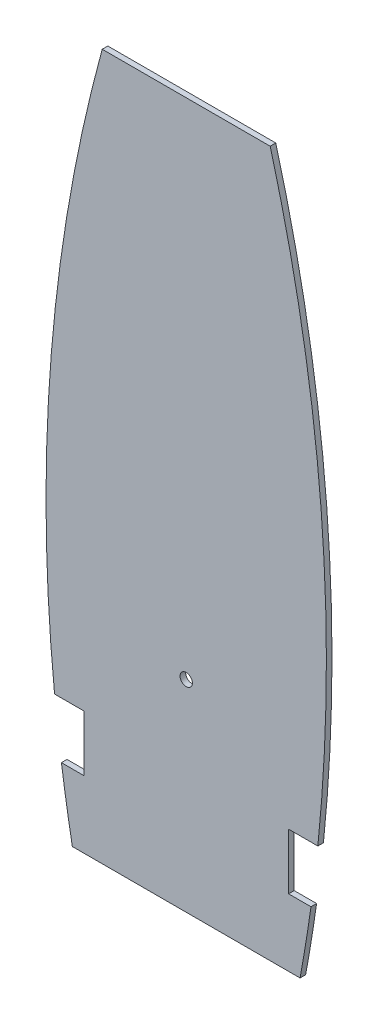
ISO-10303-21;
HEADER;
FILE_DESCRIPTION(('STEP AP214'),'2;1');
FILE_NAME('part.step','',(''),(''),'','','');
FILE_SCHEMA(('AUTOMOTIVE_DESIGN { 1 0 10303 214 1 1 1 1 }'));
ENDSEC;
DATA;
#1=APPLICATION_CONTEXT('core data for automotive mechanical design processes');
#2=APPLICATION_PROTOCOL_DEFINITION('international standard','automotive_design',2000,#1);
#3=PRODUCT_CONTEXT('',#1,'mechanical');
#4=PRODUCT('Part','Part','',(#3));
#5=PRODUCT_RELATED_PRODUCT_CATEGORY('part','',(#4));
#6=PRODUCT_DEFINITION_FORMATION('','',#4);
#7=PRODUCT_DEFINITION_CONTEXT('part definition',#1,'design');
#8=PRODUCT_DEFINITION('design','',#6,#7);
#9=PRODUCT_DEFINITION_SHAPE('','',#8);
#10=(LENGTH_UNIT() NAMED_UNIT(*) SI_UNIT(.MILLI.,.METRE.));
#11=(NAMED_UNIT(*) PLANE_ANGLE_UNIT() SI_UNIT($,.RADIAN.));
#12=(NAMED_UNIT(*) SI_UNIT($,.STERADIAN.) SOLID_ANGLE_UNIT());
#13=UNCERTAINTY_MEASURE_WITH_UNIT(LENGTH_MEASURE(1.E-05),#10,'distance_accuracy_value','');
#14=(GEOMETRIC_REPRESENTATION_CONTEXT(3) GLOBAL_UNCERTAINTY_ASSIGNED_CONTEXT((#13)) GLOBAL_UNIT_ASSIGNED_CONTEXT((#10,
#11,#12)) REPRESENTATION_CONTEXT('',''));
#15=CARTESIAN_POINT('',(0.,0.,0.));
#16=DIRECTION('',(0.,0.,1.));
#17=DIRECTION('',(1.,0.,0.));
#18=AXIS2_PLACEMENT_3D('',#15,#16,#17);
#19=CARTESIAN_POINT('',(-1287.92539340169,-373.27505620024,5.));
#20=DIRECTION('',(0.,0.,-1.));
#21=DIRECTION('',(-1.,0.,0.));
#22=AXIS2_PLACEMENT_3D('',#19,#20,#21);
#23=CYLINDRICAL_SURFACE('',#22,1413.11708487317);
#24=CARTESIAN_POINT('',(-1287.92539340169,-373.27505620024,5.));
#25=DIRECTION('',(0.,0.,1.));
#26=DIRECTION('',(-1.,0.,0.));
#27=AXIS2_PLACEMENT_3D('',#24,#25,#26);
#28=CIRCLE('',#27,1413.11708487317);
#29=CARTESIAN_POINT('',(117.553772728993,-520.,5.));
#30=VERTEX_POINT('',#29);
#31=CARTESIAN_POINT('',(75.,0.,5.));
#32=VERTEX_POINT('',#31);
#33=EDGE_CURVE('E158',#30,#32,#28,.T.);
#34=ORIENTED_EDGE('',*,*,#33,.F.);
#35=DIRECTION('',(0.,0.,-1.));
#36=VECTOR('',#35,1.);
#37=CARTESIAN_POINT('',(117.553772728993,-520.,5.));
#38=LINE('',#37,#36);
#39=CARTESIAN_POINT('',(117.553772728993,-520.,0.));
#40=VERTEX_POINT('',#39);
#41=EDGE_CURVE('E204',#30,#40,#38,.T.);
#42=ORIENTED_EDGE('',*,*,#41,.T.);
#43=CARTESIAN_POINT('',(-1287.92539340169,-373.27505620024,0.));
#44=DIRECTION('',(0.,0.,1.));
#45=DIRECTION('',(-1.,0.,0.));
#46=AXIS2_PLACEMENT_3D('',#43,#44,#45);
#47=CIRCLE('',#46,1413.11708487317);
#48=CARTESIAN_POINT('',(75.,0.,0.));
#49=VERTEX_POINT('',#48);
#50=EDGE_CURVE('E151',#40,#49,#47,.T.);
#51=ORIENTED_EDGE('',*,*,#50,.T.);
#52=DIRECTION('',(0.,0.,-1.));
#53=VECTOR('',#52,1.);
#54=CARTESIAN_POINT('',(75.,0.,5.));
#55=LINE('',#54,#53);
#56=EDGE_CURVE('E11',#32,#49,#55,.T.);
#57=ORIENTED_EDGE('',*,*,#56,.F.);
#58=EDGE_LOOP('',(#34,#42,#51,#57));
#59=FACE_BOUND('',#58,.T.);
#60=ADVANCED_FACE('F33',(#59),#23,.T.);
#61=CARTESIAN_POINT('',(1287.92539340169,-373.27505620024,5.));
#62=DIRECTION('',(0.,0.,-1.));
#63=DIRECTION('',(-1.,0.,0.));
#64=AXIS2_PLACEMENT_3D('',#61,#62,#63);
#65=CYLINDRICAL_SURFACE('',#64,1413.11708487317);
#66=CARTESIAN_POINT('',(1287.92539340169,-373.27505620024,0.));
#67=DIRECTION('',(0.,0.,1.));
#68=DIRECTION('',(1.,0.,0.));
#69=AXIS2_PLACEMENT_3D('',#66,#67,#68);
#70=CIRCLE('',#69,1413.11708487317);
#71=CARTESIAN_POINT('',(-111.431313105777,-570.,0.));
#72=VERTEX_POINT('',#71);
#73=CARTESIAN_POINT('',(-101.676059818425,-630.,0.));
#74=VERTEX_POINT('',#73);
#75=EDGE_CURVE('E157',#72,#74,#70,.T.);
#76=ORIENTED_EDGE('',*,*,#75,.T.);
#77=DIRECTION('',(0.,0.,-1.));
#78=VECTOR('',#77,1.);
#79=CARTESIAN_POINT('',(-101.676059818425,-630.,5.));
#80=LINE('',#79,#78);
#81=CARTESIAN_POINT('',(-101.676059818425,-630.,5.));
#82=VERTEX_POINT('',#81);
#83=EDGE_CURVE('E48',#82,#74,#80,.T.);
#84=ORIENTED_EDGE('',*,*,#83,.F.);
#85=CARTESIAN_POINT('',(1287.92539340169,-373.27505620024,5.));
#86=DIRECTION('',(0.,0.,1.));
#87=DIRECTION('',(1.,0.,0.));
#88=AXIS2_PLACEMENT_3D('',#85,#86,#87);
#89=CIRCLE('',#88,1413.11708487317);
#90=CARTESIAN_POINT('',(-111.431313105777,-570.,5.));
#91=VERTEX_POINT('',#90);
#92=EDGE_CURVE('E146',#91,#82,#89,.T.);
#93=ORIENTED_EDGE('',*,*,#92,.F.);
#94=DIRECTION('',(0.,0.,-1.));
#95=VECTOR('',#94,1.);
#96=CARTESIAN_POINT('',(-111.431313105777,-570.,5.));
#97=LINE('',#96,#95);
#98=EDGE_CURVE('E166',#91,#72,#97,.T.);
#99=ORIENTED_EDGE('',*,*,#98,.T.);
#100=EDGE_LOOP('',(#76,#84,#93,#99));
#101=FACE_BOUND('',#100,.T.);
#102=ADVANCED_FACE('F164',(#101),#65,.T.);
#103=CARTESIAN_POINT('',(101.676059818425,-630.,5.));
#104=VERTEX_POINT('',#103);
#105=CARTESIAN_POINT('',(111.431313105777,-570.,5.));
#106=VERTEX_POINT('',#105);
#107=EDGE_CURVE('E159',#104,#106,#28,.T.);
#108=ORIENTED_EDGE('',*,*,#107,.F.);
#109=DIRECTION('',(0.,0.,-1.));
#110=VECTOR('',#109,1.);
#111=CARTESIAN_POINT('',(101.676059818425,-630.,5.));
#112=LINE('',#111,#110);
#113=CARTESIAN_POINT('',(101.676059818425,-630.,0.));
#114=VERTEX_POINT('',#113);
#115=EDGE_CURVE('E182',#104,#114,#112,.T.);
#116=ORIENTED_EDGE('',*,*,#115,.T.);
#117=CARTESIAN_POINT('',(111.431313105777,-570.,0.));
#118=VERTEX_POINT('',#117);
#119=EDGE_CURVE('E153',#114,#118,#47,.T.);
#120=ORIENTED_EDGE('',*,*,#119,.T.);
#121=DIRECTION('',(0.,0.,-1.));
#122=VECTOR('',#121,1.);
#123=CARTESIAN_POINT('',(111.431313105777,-570.,5.));
#124=LINE('',#123,#122);
#125=EDGE_CURVE('E196',#106,#118,#124,.T.);
#126=ORIENTED_EDGE('',*,*,#125,.F.);
#127=EDGE_LOOP('',(#108,#116,#120,#126));
#128=FACE_BOUND('',#127,.T.);
#129=ADVANCED_FACE('F35',(#128),#23,.T.);
#130=CARTESIAN_POINT('',(-75.,0.,5.));
#131=DIRECTION('',(0.,-1.,0.));
#132=DIRECTION('',(1.,0.,0.));
#133=AXIS2_PLACEMENT_3D('',#130,#131,#132);
#134=PLANE('',#133);
#135=DIRECTION('',(-1.,0.,0.));
#136=VECTOR('',#135,1.);
#137=CARTESIAN_POINT('',(-75.,0.,0.));
#138=LINE('',#137,#136);
#139=CARTESIAN_POINT('',(-75.,0.,0.));
#140=VERTEX_POINT('',#139);
#141=EDGE_CURVE('E155',#49,#140,#138,.T.);
#142=ORIENTED_EDGE('',*,*,#141,.T.);
#143=DIRECTION('',(0.,0.,-1.));
#144=VECTOR('',#143,1.);
#145=CARTESIAN_POINT('',(-75.,0.,5.));
#146=LINE('',#145,#144);
#147=CARTESIAN_POINT('',(-75.,0.,5.));
#148=VERTEX_POINT('',#147);
#149=EDGE_CURVE('E41',#148,#140,#146,.T.);
#150=ORIENTED_EDGE('',*,*,#149,.F.);
#151=DIRECTION('',(-1.,0.,0.));
#152=VECTOR('',#151,1.);
#153=CARTESIAN_POINT('',(-75.,0.,5.));
#154=LINE('',#153,#152);
#155=EDGE_CURVE('E144',#32,#148,#154,.T.);
#156=ORIENTED_EDGE('',*,*,#155,.F.);
#157=ORIENTED_EDGE('',*,*,#56,.T.);
#158=EDGE_LOOP('',(#142,#150,#156,#157));
#159=FACE_BOUND('',#158,.T.);
#160=ADVANCED_FACE('F240',(#159),#134,.F.);
#161=CARTESIAN_POINT('',(-117.553772728993,-520.,0.));
#162=VERTEX_POINT('',#161);
#163=EDGE_CURVE('E138',#140,#162,#70,.T.);
#164=ORIENTED_EDGE('',*,*,#163,.T.);
#165=DIRECTION('',(0.,0.,-1.));
#166=VECTOR('',#165,1.);
#167=CARTESIAN_POINT('',(-117.553772728993,-520.,5.));
#168=LINE('',#167,#166);
#169=CARTESIAN_POINT('',(-117.553772728993,-520.,5.));
#170=VERTEX_POINT('',#169);
#171=EDGE_CURVE('E56',#170,#162,#168,.T.);
#172=ORIENTED_EDGE('',*,*,#171,.F.);
#173=EDGE_CURVE('E136',#148,#170,#89,.T.);
#174=ORIENTED_EDGE('',*,*,#173,.F.);
#175=ORIENTED_EDGE('',*,*,#149,.T.);
#176=EDGE_LOOP('',(#164,#172,#174,#175));
#177=FACE_BOUND('',#176,.T.);
#178=ADVANCED_FACE('F134',(#177),#65,.T.);
#179=CARTESIAN_POINT('',(-1287.92539340169,-373.27505620024,5.));
#180=DIRECTION('',(0.,0.,-1.));
#181=DIRECTION('',(-1.,0.,0.));
#182=AXIS2_PLACEMENT_3D('',#179,#180,#181);
#183=PLANE('',#182);
#184=CARTESIAN_POINT('',(0.,-450.,5.));
#185=DIRECTION('',(0.,0.,-1.));
#186=DIRECTION('',(-1.,0.,0.));
#187=AXIS2_PLACEMENT_3D('',#184,#185,#186);
#188=CIRCLE('',#187,5.5);
#189=CARTESIAN_POINT('',(-5.5,-450.,5.));
#190=VERTEX_POINT('',#189);
#191=EDGE_CURVE('E154',#190,#190,#188,.T.);
#192=ORIENTED_EDGE('',*,*,#191,.T.);
#193=EDGE_LOOP('',(#192));
#194=FACE_BOUND('',#193,.T.);
#195=ORIENTED_EDGE('',*,*,#92,.T.);
#196=DIRECTION('',(1.,0.,0.));
#197=VECTOR('',#196,1.);
#198=CARTESIAN_POINT('',(-101.676059818425,-630.,5.));
#199=LINE('',#198,#197);
#200=EDGE_CURVE('E177',#82,#104,#199,.T.);
#201=ORIENTED_EDGE('',*,*,#200,.T.);
#202=ORIENTED_EDGE('',*,*,#107,.T.);
#203=DIRECTION('',(-1.,0.,0.));
#204=VECTOR('',#203,1.);
#205=CARTESIAN_POINT('',(91.4313131057769,-570.,5.));
#206=LINE('',#205,#204);
#207=CARTESIAN_POINT('',(91.4313131057769,-570.,5.));
#208=VERTEX_POINT('',#207);
#209=EDGE_CURVE('E186',#106,#208,#206,.T.);
#210=ORIENTED_EDGE('',*,*,#209,.T.);
#211=DIRECTION('',(0.,1.,0.));
#212=VECTOR('',#211,1.);
#213=CARTESIAN_POINT('',(91.4313131057769,-520.,5.));
#214=LINE('',#213,#212);
#215=CARTESIAN_POINT('',(91.4313131057769,-520.,5.));
#216=VERTEX_POINT('',#215);
#217=EDGE_CURVE('E189',#208,#216,#214,.T.);
#218=ORIENTED_EDGE('',*,*,#217,.T.);
#219=DIRECTION('',(1.,0.,0.));
#220=VECTOR('',#219,1.);
#221=CARTESIAN_POINT('',(117.553772728993,-520.,5.));
#222=LINE('',#221,#220);
#223=EDGE_CURVE('E193',#216,#30,#222,.T.);
#224=ORIENTED_EDGE('',*,*,#223,.T.);
#225=ORIENTED_EDGE('',*,*,#33,.T.);
#226=ORIENTED_EDGE('',*,*,#155,.T.);
#227=ORIENTED_EDGE('',*,*,#173,.T.);
#228=DIRECTION('',(1.,0.,0.));
#229=VECTOR('',#228,1.);
#230=CARTESIAN_POINT('',(-117.553772728993,-520.,5.));
#231=LINE('',#230,#229);
#232=CARTESIAN_POINT('',(-91.4313131057769,-520.,5.));
#233=VERTEX_POINT('',#232);
#234=EDGE_CURVE('E121',#170,#233,#231,.T.);
#235=ORIENTED_EDGE('',*,*,#234,.T.);
#236=DIRECTION('',(0.,-1.,0.));
#237=VECTOR('',#236,1.);
#238=CARTESIAN_POINT('',(-91.4313131057769,-520.,5.));
#239=LINE('',#238,#237);
#240=CARTESIAN_POINT('',(-91.4313131057769,-570.,5.));
#241=VERTEX_POINT('',#240);
#242=EDGE_CURVE('E128',#233,#241,#239,.T.);
#243=ORIENTED_EDGE('',*,*,#242,.T.);
#244=DIRECTION('',(-1.,0.,0.));
#245=VECTOR('',#244,1.);
#246=CARTESIAN_POINT('',(-91.4313131057769,-570.,5.));
#247=LINE('',#246,#245);
#248=EDGE_CURVE('E139',#241,#91,#247,.T.);
#249=ORIENTED_EDGE('',*,*,#248,.T.);
#250=EDGE_LOOP('',(#195,#201,#202,#210,#218,#224,#225,#226,#227,#235,#243,#249));
#251=FACE_BOUND('',#250,.T.);
#252=ADVANCED_FACE('F142',(#194,#251),#183,.F.);
#253=CARTESIAN_POINT('',(-1287.92539340169,-373.27505620024,0.));
#254=DIRECTION('',(0.,0.,-1.));
#255=DIRECTION('',(-1.,0.,0.));
#256=AXIS2_PLACEMENT_3D('',#253,#254,#255);
#257=PLANE('',#256);
#258=DIRECTION('',(1.,0.,0.));
#259=VECTOR('',#258,1.);
#260=CARTESIAN_POINT('',(-101.676059818425,-630.,0.));
#261=LINE('',#260,#259);
#262=EDGE_CURVE('E173',#74,#114,#261,.T.);
#263=ORIENTED_EDGE('',*,*,#262,.F.);
#264=ORIENTED_EDGE('',*,*,#75,.F.);
#265=DIRECTION('',(-1.,0.,0.));
#266=VECTOR('',#265,1.);
#267=CARTESIAN_POINT('',(-91.4313131057769,-570.,0.));
#268=LINE('',#267,#266);
#269=CARTESIAN_POINT('',(-91.4313131057769,-570.,0.));
#270=VERTEX_POINT('',#269);
#271=EDGE_CURVE('E129',#270,#72,#268,.T.);
#272=ORIENTED_EDGE('',*,*,#271,.F.);
#273=DIRECTION('',(0.,-1.,0.));
#274=VECTOR('',#273,1.);
#275=CARTESIAN_POINT('',(-91.4313131057769,-520.,0.));
#276=LINE('',#275,#274);
#277=CARTESIAN_POINT('',(-91.4313131057769,-520.,0.));
#278=VERTEX_POINT('',#277);
#279=EDGE_CURVE('E285',#278,#270,#276,.T.);
#280=ORIENTED_EDGE('',*,*,#279,.F.);
#281=DIRECTION('',(1.,0.,0.));
#282=VECTOR('',#281,1.);
#283=CARTESIAN_POINT('',(-117.553772728993,-520.,0.));
#284=LINE('',#283,#282);
#285=EDGE_CURVE('E184',#162,#278,#284,.T.);
#286=ORIENTED_EDGE('',*,*,#285,.F.);
#287=ORIENTED_EDGE('',*,*,#163,.F.);
#288=ORIENTED_EDGE('',*,*,#141,.F.);
#289=ORIENTED_EDGE('',*,*,#50,.F.);
#290=DIRECTION('',(1.,0.,0.));
#291=VECTOR('',#290,1.);
#292=CARTESIAN_POINT('',(117.553772728993,-520.,0.));
#293=LINE('',#292,#291);
#294=CARTESIAN_POINT('',(91.4313131057769,-520.,0.));
#295=VERTEX_POINT('',#294);
#296=EDGE_CURVE('E190',#295,#40,#293,.T.);
#297=ORIENTED_EDGE('',*,*,#296,.F.);
#298=DIRECTION('',(0.,1.,0.));
#299=VECTOR('',#298,1.);
#300=CARTESIAN_POINT('',(91.4313131057769,-520.,0.));
#301=LINE('',#300,#299);
#302=CARTESIAN_POINT('',(91.4313131057769,-570.,0.));
#303=VERTEX_POINT('',#302);
#304=EDGE_CURVE('E200',#303,#295,#301,.T.);
#305=ORIENTED_EDGE('',*,*,#304,.F.);
#306=DIRECTION('',(-1.,0.,0.));
#307=VECTOR('',#306,1.);
#308=CARTESIAN_POINT('',(91.4313131057769,-570.,0.));
#309=LINE('',#308,#307);
#310=EDGE_CURVE('E197',#118,#303,#309,.T.);
#311=ORIENTED_EDGE('',*,*,#310,.F.);
#312=ORIENTED_EDGE('',*,*,#119,.F.);
#313=EDGE_LOOP('',(#263,#264,#272,#280,#286,#287,#288,#289,#297,#305,#311,#312));
#314=FACE_BOUND('',#313,.T.);
#315=CARTESIAN_POINT('',(0.,-450.,0.));
#316=DIRECTION('',(0.,0.,-1.));
#317=DIRECTION('',(-1.,0.,0.));
#318=AXIS2_PLACEMENT_3D('',#315,#316,#317);
#319=CIRCLE('',#318,5.5);
#320=CARTESIAN_POINT('',(-5.5,-450.,0.));
#321=VERTEX_POINT('',#320);
#322=EDGE_CURVE('E207',#321,#321,#319,.T.);
#323=ORIENTED_EDGE('',*,*,#322,.F.);
#324=EDGE_LOOP('',(#323));
#325=FACE_BOUND('',#324,.T.);
#326=ADVANCED_FACE('F169',(#314,#325),#257,.T.);
#327=CARTESIAN_POINT('',(0.,-450.,5.));
#328=DIRECTION('',(0.,0.,-1.));
#329=DIRECTION('',(-1.,0.,0.));
#330=AXIS2_PLACEMENT_3D('',#327,#328,#329);
#331=CYLINDRICAL_SURFACE('',#330,5.5);
#332=ORIENTED_EDGE('',*,*,#191,.F.);
#333=EDGE_LOOP('',(#332));
#334=FACE_BOUND('',#333,.T.);
#335=ORIENTED_EDGE('',*,*,#322,.T.);
#336=EDGE_LOOP('',(#335));
#337=FACE_BOUND('',#336,.T.);
#338=ADVANCED_FACE('F218',(#334,#337),#331,.F.);
#339=CARTESIAN_POINT('',(117.553772728993,-520.,5.));
#340=DIRECTION('',(0.,1.,0.));
#341=DIRECTION('',(-1.,0.,0.));
#342=AXIS2_PLACEMENT_3D('',#339,#340,#341);
#343=PLANE('',#342);
#344=ORIENTED_EDGE('',*,*,#296,.T.);
#345=ORIENTED_EDGE('',*,*,#41,.F.);
#346=ORIENTED_EDGE('',*,*,#223,.F.);
#347=DIRECTION('',(0.,0.,-1.));
#348=VECTOR('',#347,1.);
#349=CARTESIAN_POINT('',(91.4313131057769,-520.,5.));
#350=LINE('',#349,#348);
#351=EDGE_CURVE('E208',#216,#295,#350,.T.);
#352=ORIENTED_EDGE('',*,*,#351,.T.);
#353=EDGE_LOOP('',(#344,#345,#346,#352));
#354=FACE_BOUND('',#353,.T.);
#355=ADVANCED_FACE('F226',(#354),#343,.F.);
#356=CARTESIAN_POINT('',(91.4313131057769,-520.,5.));
#357=DIRECTION('',(-1.,0.,0.));
#358=DIRECTION('',(0.,0.,1.));
#359=AXIS2_PLACEMENT_3D('',#356,#357,#358);
#360=PLANE('',#359);
#361=ORIENTED_EDGE('',*,*,#304,.T.);
#362=ORIENTED_EDGE('',*,*,#351,.F.);
#363=ORIENTED_EDGE('',*,*,#217,.F.);
#364=DIRECTION('',(0.,0.,-1.));
#365=VECTOR('',#364,1.);
#366=CARTESIAN_POINT('',(91.4313131057769,-570.,5.));
#367=LINE('',#366,#365);
#368=EDGE_CURVE('E210',#208,#303,#367,.T.);
#369=ORIENTED_EDGE('',*,*,#368,.T.);
#370=EDGE_LOOP('',(#361,#362,#363,#369));
#371=FACE_BOUND('',#370,.T.);
#372=ADVANCED_FACE('F263',(#371),#360,.F.);
#373=CARTESIAN_POINT('',(91.4313131057769,-570.,5.));
#374=DIRECTION('',(0.,-1.,0.));
#375=DIRECTION('',(0.,0.,-1.));
#376=AXIS2_PLACEMENT_3D('',#373,#374,#375);
#377=PLANE('',#376);
#378=ORIENTED_EDGE('',*,*,#310,.T.);
#379=ORIENTED_EDGE('',*,*,#368,.F.);
#380=ORIENTED_EDGE('',*,*,#209,.F.);
#381=ORIENTED_EDGE('',*,*,#125,.T.);
#382=EDGE_LOOP('',(#378,#379,#380,#381));
#383=FACE_BOUND('',#382,.T.);
#384=ADVANCED_FACE('F267',(#383),#377,.F.);
#385=CARTESIAN_POINT('',(-91.4313131057769,-570.,5.));
#386=DIRECTION('',(0.,-1.,0.));
#387=DIRECTION('',(0.,0.,-1.));
#388=AXIS2_PLACEMENT_3D('',#385,#386,#387);
#389=PLANE('',#388);
#390=ORIENTED_EDGE('',*,*,#271,.T.);
#391=ORIENTED_EDGE('',*,*,#98,.F.);
#392=ORIENTED_EDGE('',*,*,#248,.F.);
#393=DIRECTION('',(0.,0.,-1.));
#394=VECTOR('',#393,1.);
#395=CARTESIAN_POINT('',(-91.4313131057769,-570.,5.));
#396=LINE('',#395,#394);
#397=EDGE_CURVE('E293',#241,#270,#396,.T.);
#398=ORIENTED_EDGE('',*,*,#397,.T.);
#399=EDGE_LOOP('',(#390,#391,#392,#398));
#400=FACE_BOUND('',#399,.T.);
#401=ADVANCED_FACE('F270',(#400),#389,.F.);
#402=CARTESIAN_POINT('',(-91.4313131057769,-520.,5.));
#403=DIRECTION('',(1.,0.,0.));
#404=DIRECTION('',(0.,0.,-1.));
#405=AXIS2_PLACEMENT_3D('',#402,#403,#404);
#406=PLANE('',#405);
#407=ORIENTED_EDGE('',*,*,#279,.T.);
#408=ORIENTED_EDGE('',*,*,#397,.F.);
#409=ORIENTED_EDGE('',*,*,#242,.F.);
#410=DIRECTION('',(0.,0.,-1.));
#411=VECTOR('',#410,1.);
#412=CARTESIAN_POINT('',(-91.4313131057769,-520.,5.));
#413=LINE('',#412,#411);
#414=EDGE_CURVE('E123',#233,#278,#413,.T.);
#415=ORIENTED_EDGE('',*,*,#414,.T.);
#416=EDGE_LOOP('',(#407,#408,#409,#415));
#417=FACE_BOUND('',#416,.T.);
#418=ADVANCED_FACE('F257',(#417),#406,.F.);
#419=CARTESIAN_POINT('',(-117.553772728993,-520.,5.));
#420=DIRECTION('',(0.,1.,0.));
#421=DIRECTION('',(-1.,0.,0.));
#422=AXIS2_PLACEMENT_3D('',#419,#420,#421);
#423=PLANE('',#422);
#424=ORIENTED_EDGE('',*,*,#285,.T.);
#425=ORIENTED_EDGE('',*,*,#414,.F.);
#426=ORIENTED_EDGE('',*,*,#234,.F.);
#427=ORIENTED_EDGE('',*,*,#171,.T.);
#428=EDGE_LOOP('',(#424,#425,#426,#427));
#429=FACE_BOUND('',#428,.T.);
#430=ADVANCED_FACE('F122',(#429),#423,.F.);
#431=CARTESIAN_POINT('',(-101.676059818425,-630.,5.));
#432=DIRECTION('',(0.,1.,0.));
#433=DIRECTION('',(-1.,0.,0.));
#434=AXIS2_PLACEMENT_3D('',#431,#432,#433);
#435=PLANE('',#434);
#436=ORIENTED_EDGE('',*,*,#262,.T.);
#437=ORIENTED_EDGE('',*,*,#115,.F.);
#438=ORIENTED_EDGE('',*,*,#200,.F.);
#439=ORIENTED_EDGE('',*,*,#83,.T.);
#440=EDGE_LOOP('',(#436,#437,#438,#439));
#441=FACE_BOUND('',#440,.T.);
#442=ADVANCED_FACE('F251',(#441),#435,.F.);
#443=CLOSED_SHELL('',(#60,#102,#129,#160,#178,#252,#326,#338,#355,#372,#384,#401,#418,#430,#442));
#444=MANIFOLD_SOLID_BREP('B2',#443);
#445=ADVANCED_BREP_SHAPE_REPRESENTATION('',(#18,#444),#14);
#446=SHAPE_DEFINITION_REPRESENTATION(#9,#445);
ENDSEC;
END-ISO-10303-21;
